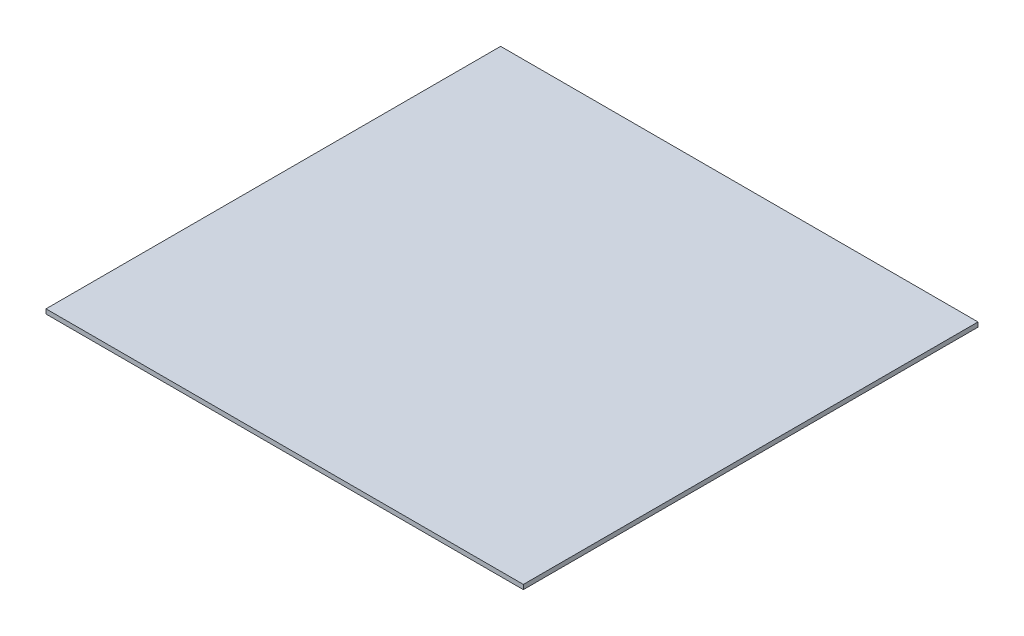
ISO-10303-21;
HEADER;
FILE_DESCRIPTION(('STEP AP214'),'2;1');
FILE_NAME('part.step','',(''),(''),'','','');
FILE_SCHEMA(('AUTOMOTIVE_DESIGN { 1 0 10303 214 1 1 1 1 }'));
ENDSEC;
DATA;
#1=APPLICATION_CONTEXT('core data for automotive mechanical design processes');
#2=APPLICATION_PROTOCOL_DEFINITION('international standard','automotive_design',2000,#1);
#3=PRODUCT_CONTEXT('',#1,'mechanical');
#4=PRODUCT('Part','Part','',(#3));
#5=PRODUCT_RELATED_PRODUCT_CATEGORY('part','',(#4));
#6=PRODUCT_DEFINITION_FORMATION('','',#4);
#7=PRODUCT_DEFINITION_CONTEXT('part definition',#1,'design');
#8=PRODUCT_DEFINITION('design','',#6,#7);
#9=PRODUCT_DEFINITION_SHAPE('','',#8);
#10=(LENGTH_UNIT() NAMED_UNIT(*) SI_UNIT(.MILLI.,.METRE.));
#11=(NAMED_UNIT(*) PLANE_ANGLE_UNIT() SI_UNIT($,.RADIAN.));
#12=(NAMED_UNIT(*) SI_UNIT($,.STERADIAN.) SOLID_ANGLE_UNIT());
#13=UNCERTAINTY_MEASURE_WITH_UNIT(LENGTH_MEASURE(1.E-05),#10,'distance_accuracy_value','');
#14=(GEOMETRIC_REPRESENTATION_CONTEXT(3) GLOBAL_UNCERTAINTY_ASSIGNED_CONTEXT((#13)) GLOBAL_UNIT_ASSIGNED_CONTEXT((#10,
#11,#12)) REPRESENTATION_CONTEXT('',''));
#15=CARTESIAN_POINT('',(0.,0.,0.));
#16=DIRECTION('',(0.,0.,1.));
#17=DIRECTION('',(1.,0.,0.));
#18=AXIS2_PLACEMENT_3D('',#15,#16,#17);
#19=CARTESIAN_POINT('',(0.,10.,45.));
#20=DIRECTION('',(0.,0.,1.));
#21=DIRECTION('',(1.,0.,0.));
#22=AXIS2_PLACEMENT_3D('',#19,#20,#21);
#23=PLANE('',#22);
#24=DIRECTION('',(0.,1.,0.));
#25=VECTOR('',#24,1.);
#26=CARTESIAN_POINT('',(21.,10.,45.));
#27=LINE('',#26,#25);
#28=CARTESIAN_POINT('',(21.,10.,45.));
#29=VERTEX_POINT('',#28);
#30=CARTESIAN_POINT('',(21.,10.2,45.));
#31=VERTEX_POINT('',#30);
#32=EDGE_CURVE('E11',#29,#31,#27,.T.);
#33=ORIENTED_EDGE('',*,*,#32,.F.);
#34=DIRECTION('',(1.,0.,0.));
#35=VECTOR('',#34,1.);
#36=CARTESIAN_POINT('',(0.,10.,45.));
#37=LINE('',#36,#35);
#38=CARTESIAN_POINT('',(0.,10.,45.));
#39=VERTEX_POINT('',#38);
#40=EDGE_CURVE('E88',#29,#39,#37,.F.);
#41=ORIENTED_EDGE('',*,*,#40,.T.);
#42=DIRECTION('',(0.,1.,0.));
#43=VECTOR('',#42,1.);
#44=CARTESIAN_POINT('',(0.,10.,45.));
#45=LINE('',#44,#43);
#46=CARTESIAN_POINT('',(0.,10.2,45.));
#47=VERTEX_POINT('',#46);
#48=EDGE_CURVE('E43',#39,#47,#45,.T.);
#49=ORIENTED_EDGE('',*,*,#48,.T.);
#50=DIRECTION('',(1.,0.,0.));
#51=VECTOR('',#50,1.);
#52=CARTESIAN_POINT('',(0.,10.2,45.));
#53=LINE('',#52,#51);
#54=EDGE_CURVE('E101',#31,#47,#53,.F.);
#55=ORIENTED_EDGE('',*,*,#54,.F.);
#56=EDGE_LOOP('',(#33,#41,#49,#55));
#57=FACE_BOUND('',#56,.T.);
#58=ADVANCED_FACE('F33',(#57),#23,.F.);
#59=CARTESIAN_POINT('',(0.,10.,0.));
#60=DIRECTION('',(-1.,0.,0.));
#61=DIRECTION('',(0.,0.,1.));
#62=AXIS2_PLACEMENT_3D('',#59,#60,#61);
#63=PLANE('',#62);
#64=ORIENTED_EDGE('',*,*,#48,.F.);
#65=DIRECTION('',(0.,0.,1.));
#66=VECTOR('',#65,1.);
#67=CARTESIAN_POINT('',(0.,10.,0.));
#68=LINE('',#67,#66);
#69=CARTESIAN_POINT('',(0.,10.,65.));
#70=VERTEX_POINT('',#69);
#71=EDGE_CURVE('E95',#39,#70,#68,.T.);
#72=ORIENTED_EDGE('',*,*,#71,.T.);
#73=DIRECTION('',(0.,1.,0.));
#74=VECTOR('',#73,1.);
#75=CARTESIAN_POINT('',(0.,10.,65.));
#76=LINE('',#75,#74);
#77=CARTESIAN_POINT('',(0.,10.2,65.));
#78=VERTEX_POINT('',#77);
#79=EDGE_CURVE('E51',#70,#78,#76,.T.);
#80=ORIENTED_EDGE('',*,*,#79,.T.);
#81=DIRECTION('',(0.,0.,1.));
#82=VECTOR('',#81,1.);
#83=CARTESIAN_POINT('',(0.,10.2,0.));
#84=LINE('',#83,#82);
#85=EDGE_CURVE('E82',#47,#78,#84,.T.);
#86=ORIENTED_EDGE('',*,*,#85,.F.);
#87=EDGE_LOOP('',(#64,#72,#80,#86));
#88=FACE_BOUND('',#87,.T.);
#89=ADVANCED_FACE('F105',(#88),#63,.T.);
#90=CARTESIAN_POINT('',(0.,10.,65.));
#91=DIRECTION('',(0.,0.,1.));
#92=DIRECTION('',(1.,0.,0.));
#93=AXIS2_PLACEMENT_3D('',#90,#91,#92);
#94=PLANE('',#93);
#95=ORIENTED_EDGE('',*,*,#79,.F.);
#96=DIRECTION('',(1.,0.,0.));
#97=VECTOR('',#96,1.);
#98=CARTESIAN_POINT('',(0.,10.,65.));
#99=LINE('',#98,#97);
#100=CARTESIAN_POINT('',(21.,10.,65.));
#101=VERTEX_POINT('',#100);
#102=EDGE_CURVE('E87',#101,#70,#99,.F.);
#103=ORIENTED_EDGE('',*,*,#102,.F.);
#104=DIRECTION('',(0.,1.,0.));
#105=VECTOR('',#104,1.);
#106=CARTESIAN_POINT('',(21.,10.,65.));
#107=LINE('',#106,#105);
#108=CARTESIAN_POINT('',(21.,10.2,65.));
#109=VERTEX_POINT('',#108);
#110=EDGE_CURVE('E37',#101,#109,#107,.T.);
#111=ORIENTED_EDGE('',*,*,#110,.T.);
#112=DIRECTION('',(1.,0.,0.));
#113=VECTOR('',#112,1.);
#114=CARTESIAN_POINT('',(0.,10.2,65.));
#115=LINE('',#114,#113);
#116=EDGE_CURVE('E97',#109,#78,#115,.F.);
#117=ORIENTED_EDGE('',*,*,#116,.T.);
#118=EDGE_LOOP('',(#95,#103,#111,#117));
#119=FACE_BOUND('',#118,.T.);
#120=ADVANCED_FACE('F90',(#119),#94,.T.);
#121=CARTESIAN_POINT('',(21.,10.,0.));
#122=DIRECTION('',(-1.,0.,0.));
#123=DIRECTION('',(0.,0.,1.));
#124=AXIS2_PLACEMENT_3D('',#121,#122,#123);
#125=PLANE('',#124);
#126=DIRECTION('',(0.,0.,1.));
#127=VECTOR('',#126,1.);
#128=CARTESIAN_POINT('',(21.,10.,0.));
#129=LINE('',#128,#127);
#130=EDGE_CURVE('E76',#101,#29,#129,.F.);
#131=ORIENTED_EDGE('',*,*,#130,.T.);
#132=ORIENTED_EDGE('',*,*,#32,.T.);
#133=DIRECTION('',(0.,0.,1.));
#134=VECTOR('',#133,1.);
#135=CARTESIAN_POINT('',(21.,10.2,0.));
#136=LINE('',#135,#134);
#137=EDGE_CURVE('E78',#109,#31,#136,.F.);
#138=ORIENTED_EDGE('',*,*,#137,.F.);
#139=ORIENTED_EDGE('',*,*,#110,.F.);
#140=EDGE_LOOP('',(#131,#132,#138,#139));
#141=FACE_BOUND('',#140,.T.);
#142=ADVANCED_FACE('F35',(#141),#125,.F.);
#143=CARTESIAN_POINT('',(0.,10.2,0.));
#144=DIRECTION('',(0.,1.,0.));
#145=DIRECTION('',(0.,0.,1.));
#146=AXIS2_PLACEMENT_3D('',#143,#144,#145);
#147=PLANE('',#146);
#148=ORIENTED_EDGE('',*,*,#116,.F.);
#149=ORIENTED_EDGE('',*,*,#137,.T.);
#150=ORIENTED_EDGE('',*,*,#54,.T.);
#151=ORIENTED_EDGE('',*,*,#85,.T.);
#152=EDGE_LOOP('',(#148,#149,#150,#151));
#153=FACE_BOUND('',#152,.T.);
#154=ADVANCED_FACE('F104',(#153),#147,.T.);
#155=CARTESIAN_POINT('',(0.,10.,0.));
#156=DIRECTION('',(0.,1.,0.));
#157=DIRECTION('',(0.,0.,1.));
#158=AXIS2_PLACEMENT_3D('',#155,#156,#157);
#159=PLANE('',#158);
#160=ORIENTED_EDGE('',*,*,#102,.T.);
#161=ORIENTED_EDGE('',*,*,#71,.F.);
#162=ORIENTED_EDGE('',*,*,#40,.F.);
#163=ORIENTED_EDGE('',*,*,#130,.F.);
#164=EDGE_LOOP('',(#160,#161,#162,#163));
#165=FACE_BOUND('',#164,.T.);
#166=ADVANCED_FACE('F85',(#165),#159,.F.);
#167=CLOSED_SHELL('',(#58,#89,#120,#142,#154,#166));
#168=MANIFOLD_SOLID_BREP('B2',#167);
#169=ADVANCED_BREP_SHAPE_REPRESENTATION('',(#18,#168),#14);
#170=SHAPE_DEFINITION_REPRESENTATION(#9,#169);
ENDSEC;
END-ISO-10303-21;
